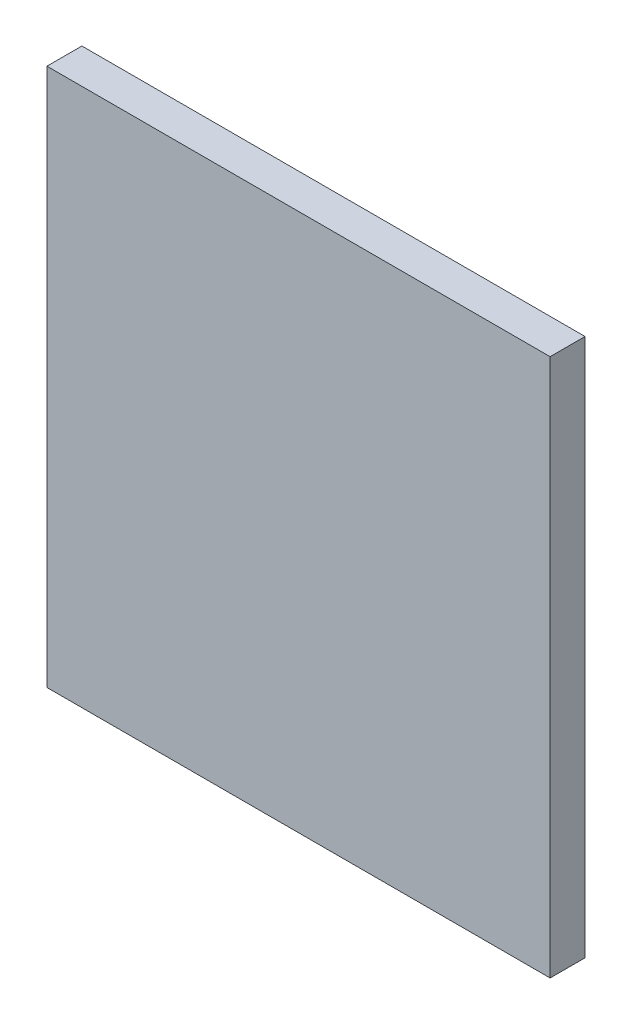
ISO-10303-21;
HEADER;
FILE_DESCRIPTION(('STEP AP214'),'2;1');
FILE_NAME('part.step','',(''),(''),'','','');
FILE_SCHEMA(('AUTOMOTIVE_DESIGN { 1 0 10303 214 1 1 1 1 }'));
ENDSEC;
DATA;
#1=APPLICATION_CONTEXT('core data for automotive mechanical design processes');
#2=APPLICATION_PROTOCOL_DEFINITION('international standard','automotive_design',2000,#1);
#3=PRODUCT_CONTEXT('',#1,'mechanical');
#4=PRODUCT('Part','Part','',(#3));
#5=PRODUCT_RELATED_PRODUCT_CATEGORY('part','',(#4));
#6=PRODUCT_DEFINITION_FORMATION('','',#4);
#7=PRODUCT_DEFINITION_CONTEXT('part definition',#1,'design');
#8=PRODUCT_DEFINITION('design','',#6,#7);
#9=PRODUCT_DEFINITION_SHAPE('','',#8);
#10=(LENGTH_UNIT() NAMED_UNIT(*) SI_UNIT(.MILLI.,.METRE.));
#11=(NAMED_UNIT(*) PLANE_ANGLE_UNIT() SI_UNIT($,.RADIAN.));
#12=(NAMED_UNIT(*) SI_UNIT($,.STERADIAN.) SOLID_ANGLE_UNIT());
#13=UNCERTAINTY_MEASURE_WITH_UNIT(LENGTH_MEASURE(1.E-05),#10,'distance_accuracy_value','');
#14=(GEOMETRIC_REPRESENTATION_CONTEXT(3) GLOBAL_UNCERTAINTY_ASSIGNED_CONTEXT((#13)) GLOBAL_UNIT_ASSIGNED_CONTEXT((#10,
#11,#12)) REPRESENTATION_CONTEXT('',''));
#15=CARTESIAN_POINT('',(0.,0.,0.));
#16=DIRECTION('',(0.,0.,1.));
#17=DIRECTION('',(1.,0.,0.));
#18=AXIS2_PLACEMENT_3D('',#15,#16,#17);
#19=CARTESIAN_POINT('',(0.,0.,0.1));
#20=DIRECTION('',(0.,0.,1.));
#21=DIRECTION('',(1.,0.,0.));
#22=AXIS2_PLACEMENT_3D('',#19,#20,#21);
#23=PLANE('',#22);
#24=DIRECTION('',(0.,1.,0.));
#25=VECTOR('',#24,1.);
#26=CARTESIAN_POINT('',(1.44,0.,0.1));
#27=LINE('',#26,#25);
#28=CARTESIAN_POINT('',(1.44,1.54,0.1));
#29=VERTEX_POINT('',#28);
#30=CARTESIAN_POINT('',(1.44,0.,0.1));
#31=VERTEX_POINT('',#30);
#32=EDGE_CURVE('E76',#29,#31,#27,.F.);
#33=ORIENTED_EDGE('',*,*,#32,.F.);
#34=DIRECTION('',(1.,0.,0.));
#35=VECTOR('',#34,1.);
#36=CARTESIAN_POINT('',(0.,1.54,0.1));
#37=LINE('',#36,#35);
#38=CARTESIAN_POINT('',(0.,1.54,0.1));
#39=VERTEX_POINT('',#38);
#40=EDGE_CURVE('E58',#39,#29,#37,.T.);
#41=ORIENTED_EDGE('',*,*,#40,.F.);
#42=DIRECTION('',(0.,1.,0.));
#43=VECTOR('',#42,1.);
#44=CARTESIAN_POINT('',(0.,0.,0.1));
#45=LINE('',#44,#43);
#46=CARTESIAN_POINT('',(0.,0.,0.1));
#47=VERTEX_POINT('',#46);
#48=EDGE_CURVE('E20',#39,#47,#45,.F.);
#49=ORIENTED_EDGE('',*,*,#48,.T.);
#50=DIRECTION('',(1.,0.,0.));
#51=VECTOR('',#50,1.);
#52=CARTESIAN_POINT('',(0.,0.,0.1));
#53=LINE('',#52,#51);
#54=EDGE_CURVE('E55',#47,#31,#53,.T.);
#55=ORIENTED_EDGE('',*,*,#54,.T.);
#56=EDGE_LOOP('',(#33,#41,#49,#55));
#57=FACE_BOUND('',#56,.T.);
#58=ADVANCED_FACE('F17',(#57),#23,.T.);
#59=CARTESIAN_POINT('',(0.,0.,0.));
#60=DIRECTION('',(1.,0.,0.));
#61=DIRECTION('',(0.,0.,-1.));
#62=AXIS2_PLACEMENT_3D('',#59,#60,#61);
#63=PLANE('',#62);
#64=DIRECTION('',(0.,0.,1.));
#65=VECTOR('',#64,1.);
#66=CARTESIAN_POINT('',(0.,1.54,0.));
#67=LINE('',#66,#65);
#68=CARTESIAN_POINT('',(0.,1.54,0.));
#69=VERTEX_POINT('',#68);
#70=EDGE_CURVE('E78',#69,#39,#67,.T.);
#71=ORIENTED_EDGE('',*,*,#70,.F.);
#72=DIRECTION('',(0.,1.,0.));
#73=VECTOR('',#72,1.);
#74=CARTESIAN_POINT('',(0.,0.,0.));
#75=LINE('',#74,#73);
#76=CARTESIAN_POINT('',(0.,0.,0.));
#77=VERTEX_POINT('',#76);
#78=EDGE_CURVE('E73',#69,#77,#75,.F.);
#79=ORIENTED_EDGE('',*,*,#78,.T.);
#80=DIRECTION('',(0.,0.,1.));
#81=VECTOR('',#80,1.);
#82=CARTESIAN_POINT('',(0.,0.,0.));
#83=LINE('',#82,#81);
#84=EDGE_CURVE('E63',#77,#47,#83,.T.);
#85=ORIENTED_EDGE('',*,*,#84,.T.);
#86=ORIENTED_EDGE('',*,*,#48,.F.);
#87=EDGE_LOOP('',(#71,#79,#85,#86));
#88=FACE_BOUND('',#87,.T.);
#89=ADVANCED_FACE('F72',(#88),#63,.F.);
#90=CARTESIAN_POINT('',(0.,0.,0.));
#91=DIRECTION('',(0.,1.,0.));
#92=DIRECTION('',(0.,0.,1.));
#93=AXIS2_PLACEMENT_3D('',#90,#91,#92);
#94=PLANE('',#93);
#95=ORIENTED_EDGE('',*,*,#54,.F.);
#96=ORIENTED_EDGE('',*,*,#84,.F.);
#97=DIRECTION('',(1.,0.,0.));
#98=VECTOR('',#97,1.);
#99=CARTESIAN_POINT('',(0.,0.,0.));
#100=LINE('',#99,#98);
#101=CARTESIAN_POINT('',(1.44,0.,0.));
#102=VERTEX_POINT('',#101);
#103=EDGE_CURVE('E83',#77,#102,#100,.T.);
#104=ORIENTED_EDGE('',*,*,#103,.T.);
#105=DIRECTION('',(0.,0.,-1.));
#106=VECTOR('',#105,1.);
#107=CARTESIAN_POINT('',(1.44,0.,0.));
#108=LINE('',#107,#106);
#109=EDGE_CURVE('E69',#31,#102,#108,.T.);
#110=ORIENTED_EDGE('',*,*,#109,.F.);
#111=EDGE_LOOP('',(#95,#96,#104,#110));
#112=FACE_BOUND('',#111,.T.);
#113=ADVANCED_FACE('F66',(#112),#94,.F.);
#114=CARTESIAN_POINT('',(1.44,0.,0.));
#115=DIRECTION('',(1.,0.,0.));
#116=DIRECTION('',(0.,0.,-1.));
#117=AXIS2_PLACEMENT_3D('',#114,#115,#116);
#118=PLANE('',#117);
#119=DIRECTION('',(0.,0.,1.));
#120=VECTOR('',#119,1.);
#121=CARTESIAN_POINT('',(1.44,1.54,0.));
#122=LINE('',#121,#120);
#123=CARTESIAN_POINT('',(1.44,1.54,0.));
#124=VERTEX_POINT('',#123);
#125=EDGE_CURVE('E34',#29,#124,#122,.F.);
#126=ORIENTED_EDGE('',*,*,#125,.F.);
#127=ORIENTED_EDGE('',*,*,#32,.T.);
#128=ORIENTED_EDGE('',*,*,#109,.T.);
#129=DIRECTION('',(0.,1.,0.));
#130=VECTOR('',#129,1.);
#131=CARTESIAN_POINT('',(1.44,0.,0.));
#132=LINE('',#131,#130);
#133=EDGE_CURVE('E26',#102,#124,#132,.T.);
#134=ORIENTED_EDGE('',*,*,#133,.T.);
#135=EDGE_LOOP('',(#126,#127,#128,#134));
#136=FACE_BOUND('',#135,.T.);
#137=ADVANCED_FACE('F88',(#136),#118,.T.);
#138=CARTESIAN_POINT('',(0.,1.54,0.));
#139=DIRECTION('',(0.,1.,0.));
#140=DIRECTION('',(0.,0.,1.));
#141=AXIS2_PLACEMENT_3D('',#138,#139,#140);
#142=PLANE('',#141);
#143=ORIENTED_EDGE('',*,*,#40,.T.);
#144=ORIENTED_EDGE('',*,*,#125,.T.);
#145=DIRECTION('',(1.,0.,0.));
#146=VECTOR('',#145,1.);
#147=CARTESIAN_POINT('',(0.,1.54,0.));
#148=LINE('',#147,#146);
#149=EDGE_CURVE('E11',#124,#69,#148,.F.);
#150=ORIENTED_EDGE('',*,*,#149,.T.);
#151=ORIENTED_EDGE('',*,*,#70,.T.);
#152=EDGE_LOOP('',(#143,#144,#150,#151));
#153=FACE_BOUND('',#152,.T.);
#154=ADVANCED_FACE('F91',(#153),#142,.T.);
#155=CARTESIAN_POINT('',(0.,0.,0.));
#156=DIRECTION('',(0.,0.,1.));
#157=DIRECTION('',(1.,0.,0.));
#158=AXIS2_PLACEMENT_3D('',#155,#156,#157);
#159=PLANE('',#158);
#160=ORIENTED_EDGE('',*,*,#133,.F.);
#161=ORIENTED_EDGE('',*,*,#103,.F.);
#162=ORIENTED_EDGE('',*,*,#78,.F.);
#163=ORIENTED_EDGE('',*,*,#149,.F.);
#164=EDGE_LOOP('',(#160,#161,#162,#163));
#165=FACE_BOUND('',#164,.T.);
#166=ADVANCED_FACE('F90',(#165),#159,.F.);
#167=CLOSED_SHELL('',(#58,#89,#113,#137,#154,#166));
#168=MANIFOLD_SOLID_BREP('B1',#167);
#169=ADVANCED_BREP_SHAPE_REPRESENTATION('',(#18,#168),#14);
#170=SHAPE_DEFINITION_REPRESENTATION(#9,#169);
ENDSEC;
END-ISO-10303-21;
